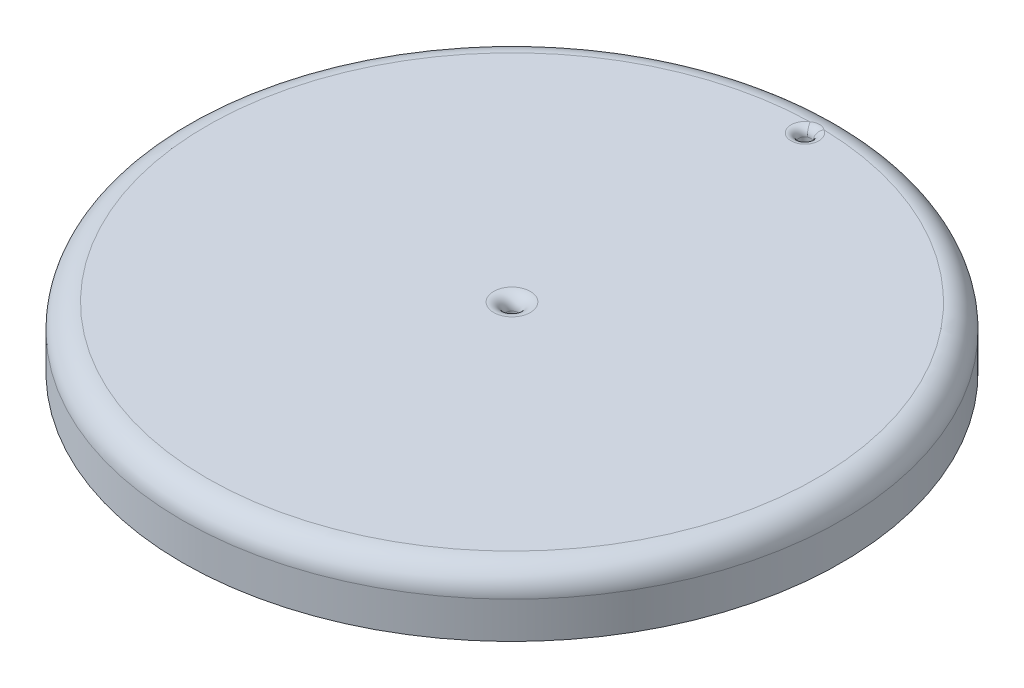
ISO-10303-21;
HEADER;
FILE_DESCRIPTION(('STEP AP214'),'2;1');
FILE_NAME('part.step','',(''),(''),'','','');
FILE_SCHEMA(('AUTOMOTIVE_DESIGN { 1 0 10303 214 1 1 1 1 }'));
ENDSEC;
DATA;
#1=APPLICATION_CONTEXT('core data for automotive mechanical design processes');
#2=APPLICATION_PROTOCOL_DEFINITION('international standard','automotive_design',2000,#1);
#3=PRODUCT_CONTEXT('',#1,'mechanical');
#4=PRODUCT('Part','Part','',(#3));
#5=PRODUCT_RELATED_PRODUCT_CATEGORY('part','',(#4));
#6=PRODUCT_DEFINITION_FORMATION('','',#4);
#7=PRODUCT_DEFINITION_CONTEXT('part definition',#1,'design');
#8=PRODUCT_DEFINITION('design','',#6,#7);
#9=PRODUCT_DEFINITION_SHAPE('','',#8);
#10=(LENGTH_UNIT() NAMED_UNIT(*) SI_UNIT(.MILLI.,.METRE.));
#11=(NAMED_UNIT(*) PLANE_ANGLE_UNIT() SI_UNIT($,.RADIAN.));
#12=(NAMED_UNIT(*) SI_UNIT($,.STERADIAN.) SOLID_ANGLE_UNIT());
#13=UNCERTAINTY_MEASURE_WITH_UNIT(LENGTH_MEASURE(1.E-05),#10,'distance_accuracy_value','');
#14=(GEOMETRIC_REPRESENTATION_CONTEXT(3) GLOBAL_UNCERTAINTY_ASSIGNED_CONTEXT((#13)) GLOBAL_UNIT_ASSIGNED_CONTEXT((#10,
#11,#12)) REPRESENTATION_CONTEXT('',''));
#15=CARTESIAN_POINT('',(0.,0.,0.));
#16=DIRECTION('',(0.,0.,1.));
#17=DIRECTION('',(1.,0.,0.));
#18=AXIS2_PLACEMENT_3D('',#15,#16,#17);
#19=CARTESIAN_POINT('',(0.,15.875,0.));
#20=DIRECTION('',(0.,1.,0.));
#21=DIRECTION('',(0.,0.,1.));
#22=AXIS2_PLACEMENT_3D('',#19,#20,#21);
#23=PLANE('',#22);
#24=CARTESIAN_POINT('',(0.,15.875,0.));
#25=DIRECTION('',(0.,1.,0.));
#26=DIRECTION('',(0.,0.,1.));
#27=AXIS2_PLACEMENT_3D('',#24,#25,#26);
#28=CIRCLE('',#27,4.7625);
#29=CARTESIAN_POINT('',(0.,15.875,4.7625));
#30=VERTEX_POINT('',#29);
#31=EDGE_CURVE('E77',#30,#30,#28,.F.);
#32=ORIENTED_EDGE('',*,*,#31,.T.);
#33=EDGE_LOOP('',(#32));
#34=FACE_BOUND('',#33,.T.);
#35=CARTESIAN_POINT('',(0.,15.875,0.));
#36=DIRECTION('',(0.,1.,0.));
#37=DIRECTION('',(0.,0.,1.));
#38=AXIS2_PLACEMENT_3D('',#35,#36,#37);
#39=CIRCLE('',#38,79.375);
#40=CARTESIAN_POINT('',(-1.77358459821745,15.875,-79.3551827083333));
#41=VERTEX_POINT('',#40);
#42=CARTESIAN_POINT('',(1.77358459821745,15.875,-79.3551827083333));
#43=VERTEX_POINT('',#42);
#44=EDGE_CURVE('E125',#41,#43,#39,.T.);
#45=ORIENTED_EDGE('',*,*,#44,.T.);
#46=CARTESIAN_POINT('',(0.,15.875,-76.2));
#47=DIRECTION('',(0.,1.,0.));
#48=DIRECTION('',(0.,0.,1.));
#49=AXIS2_PLACEMENT_3D('',#46,#47,#48);
#50=CIRCLE('',#49,3.6195);
#51=EDGE_CURVE('E47',#43,#41,#50,.F.);
#52=ORIENTED_EDGE('',*,*,#51,.T.);
#53=EDGE_LOOP('',(#45,#52));
#54=FACE_BOUND('',#53,.T.);
#55=ADVANCED_FACE('F34',(#34,#54),#23,.T.);
#56=CARTESIAN_POINT('',(0.,0.,0.));
#57=DIRECTION('',(0.,1.,0.));
#58=DIRECTION('',(0.,0.,1.));
#59=AXIS2_PLACEMENT_3D('',#56,#57,#58);
#60=PLANE('',#59);
#61=CARTESIAN_POINT('',(0.,0.,0.));
#62=DIRECTION('',(0.,1.,0.));
#63=DIRECTION('',(0.,0.,1.));
#64=AXIS2_PLACEMENT_3D('',#61,#62,#63);
#65=CIRCLE('',#64,1.5875);
#66=CARTESIAN_POINT('',(0.,0.,1.5875));
#67=VERTEX_POINT('',#66);
#68=EDGE_CURVE('E115',#67,#67,#65,.T.);
#69=ORIENTED_EDGE('',*,*,#68,.T.);
#70=EDGE_LOOP('',(#69));
#71=FACE_BOUND('',#70,.T.);
#72=CARTESIAN_POINT('',(0.,0.,0.));
#73=DIRECTION('',(0.,1.,0.));
#74=DIRECTION('',(0.,0.,1.));
#75=AXIS2_PLACEMENT_3D('',#72,#73,#74);
#76=CIRCLE('',#75,85.725);
#77=CARTESIAN_POINT('',(0.,0.,85.725));
#78=VERTEX_POINT('',#77);
#79=EDGE_CURVE('E120',#78,#78,#76,.T.);
#80=ORIENTED_EDGE('',*,*,#79,.F.);
#81=EDGE_LOOP('',(#80));
#82=FACE_BOUND('',#81,.T.);
#83=CARTESIAN_POINT('',(0.,0.,-76.2));
#84=DIRECTION('',(0.,1.,0.));
#85=DIRECTION('',(0.,0.,1.));
#86=AXIS2_PLACEMENT_3D('',#83,#84,#85);
#87=CIRCLE('',#86,1.5875);
#88=CARTESIAN_POINT('',(0.,0.,-74.6125));
#89=VERTEX_POINT('',#88);
#90=EDGE_CURVE('E113',#89,#89,#87,.T.);
#91=ORIENTED_EDGE('',*,*,#90,.T.);
#92=EDGE_LOOP('',(#91));
#93=FACE_BOUND('',#92,.T.);
#94=ADVANCED_FACE('F145',(#71,#82,#93),#60,.F.);
#95=CARTESIAN_POINT('',(0.,15.875,0.));
#96=DIRECTION('',(0.,-1.,0.));
#97=DIRECTION('',(0.,0.,-1.));
#98=AXIS2_PLACEMENT_3D('',#95,#96,#97);
#99=CYLINDRICAL_SURFACE('',#98,85.725);
#100=CARTESIAN_POINT('',(0.,9.525,0.));
#101=DIRECTION('',(0.,1.,0.));
#102=DIRECTION('',(0.,0.,1.));
#103=AXIS2_PLACEMENT_3D('',#100,#101,#102);
#104=CIRCLE('',#103,85.725);
#105=CARTESIAN_POINT('',(0.,9.525,85.725));
#106=VERTEX_POINT('',#105);
#107=EDGE_CURVE('E127',#106,#106,#104,.F.);
#108=ORIENTED_EDGE('',*,*,#107,.T.);
#109=EDGE_LOOP('',(#108));
#110=FACE_BOUND('',#109,.T.);
#111=ORIENTED_EDGE('',*,*,#79,.T.);
#112=EDGE_LOOP('',(#111));
#113=FACE_BOUND('',#112,.T.);
#114=ADVANCED_FACE('F107',(#110,#113),#99,.T.);
#115=CARTESIAN_POINT('',(0.,15.875,0.));
#116=DIRECTION('',(0.,-1.,0.));
#117=DIRECTION('',(0.,0.,-1.));
#118=AXIS2_PLACEMENT_3D('',#115,#116,#117);
#119=CYLINDRICAL_SURFACE('',#118,1.5875);
#120=CARTESIAN_POINT('',(0.,12.7,0.));
#121=DIRECTION('',(0.,1.,0.));
#122=DIRECTION('',(0.,0.,1.));
#123=AXIS2_PLACEMENT_3D('',#120,#121,#122);
#124=CIRCLE('',#123,1.5875);
#125=CARTESIAN_POINT('',(0.,12.7,1.5875));
#126=VERTEX_POINT('',#125);
#127=EDGE_CURVE('E130',#126,#126,#124,.T.);
#128=ORIENTED_EDGE('',*,*,#127,.T.);
#129=EDGE_LOOP('',(#128));
#130=FACE_BOUND('',#129,.T.);
#131=ORIENTED_EDGE('',*,*,#68,.F.);
#132=EDGE_LOOP('',(#131));
#133=FACE_BOUND('',#132,.T.);
#134=ADVANCED_FACE('F140',(#130,#133),#119,.F.);
#135=CARTESIAN_POINT('',(0.,15.875,-76.2));
#136=DIRECTION('',(0.,-1.,0.));
#137=DIRECTION('',(0.,0.,-1.));
#138=AXIS2_PLACEMENT_3D('',#135,#136,#137);
#139=CYLINDRICAL_SURFACE('',#138,1.5875);
#140=CARTESIAN_POINT('',(0.,13.843,-76.2));
#141=DIRECTION('',(0.,1.,0.));
#142=DIRECTION('',(0.,0.,1.));
#143=AXIS2_PLACEMENT_3D('',#140,#141,#142);
#144=CIRCLE('',#143,1.5875);
#145=CARTESIAN_POINT('',(-0.777887981674323,13.843,-77.5838520650585));
#146=VERTEX_POINT('',#145);
#147=CARTESIAN_POINT('',(0.777887981674323,13.843,-77.5838520650585));
#148=VERTEX_POINT('',#147);
#149=EDGE_CURVE('E75',#146,#148,#144,.T.);
#150=ORIENTED_EDGE('',*,*,#149,.T.);
#151=CARTESIAN_POINT('',(2.63476197439983,15.8003909541031,-78.360166683392));
#152=CARTESIAN_POINT('',(1.29553027419903,15.6046192049638,-77.1386593004138));
#153=CARTESIAN_POINT('',(1.16017491639139,13.7922658487901,-77.2835822134828));
#154=CARTESIAN_POINT('',(2.57294908801326,15.8152666369794,-78.4585026395729));
#155=CARTESIAN_POINT('',(1.25561948615888,15.6322657191686,-77.1888661477291));
#156=CARTESIAN_POINT('',(1.13249688038497,13.8023813135206,-77.3132212760861));
#157=CARTESIAN_POINT('',(2.50832767251595,15.8273547353237,-78.553426543925));
#158=CARTESIAN_POINT('',(1.21430838849496,15.6583466104703,-77.2355977513547));
#159=CARTESIAN_POINT('',(1.10363331625003,13.8106012204456,-77.3418428269935));
#160=CARTESIAN_POINT('',(2.37392623025085,15.8468919941276,-78.7357579610215));
#161=CARTESIAN_POINT('',(1.1296876644374,15.7079386864221,-77.3225792838114));
#162=CARTESIAN_POINT('',(1.0437372140149,13.823886556296,-77.3968373152801));
#163=CARTESIAN_POINT('',(2.30414921478429,15.8543438389557,-78.823169797899));
#164=CARTESIAN_POINT('',(1.08633357760566,15.731447265617,-77.3628095145647));
#165=CARTESIAN_POINT('',(1.01270594260589,13.8289538105919,-77.4232115461974));
#166=CARTESIAN_POINT('',(2.08797842250015,15.8711430764972,-79.0728964613576));
#167=CARTESIAN_POINT('',(0.954443826856358,15.7988444487487,-77.4741569728456));
#168=CARTESIAN_POINT('',(0.916754810817013,13.8403772918144,-77.4985817774826));
#169=CARTESIAN_POINT('',(1.93446767676193,15.874991606468,-79.2231430244142));
#170=CARTESIAN_POINT('',(0.864910306286867,15.839058604007,-77.5349037831248));
#171=CARTESIAN_POINT('',(0.848853529601271,13.8429942923296,-77.5439581546539));
#172=CARTESIAN_POINT('',(1.59737548987739,15.8750091931159,-79.4998007451051));
#173=CARTESIAN_POINT('',(0.680776706003383,15.9151082691116,-77.6384751761009));
#174=CARTESIAN_POINT('',(0.700162119910589,13.843006251394,-77.6275463456764));
#175=CARTESIAN_POINT('',(1.41232254099972,15.870411763715,-79.6225778341049));
#176=CARTESIAN_POINT('',(0.58694637861011,15.9498324628814,-77.6783200423195));
#177=CARTESIAN_POINT('',(0.618760367913626,13.8398799993966,-77.6646638665206));
#178=CARTESIAN_POINT('',(1.02991920695333,15.8595849939134,-79.8212372885054));
#179=CARTESIAN_POINT('',(0.408131649744798,16.0082118246832,-77.7377187457377));
#180=CARTESIAN_POINT('',(0.450866708262734,13.8325177957906,-77.7247378993115));
#181=CARTESIAN_POINT('',(0.832564500706439,15.8533550776003,-79.8971030726351));
#182=CARTESIAN_POINT('',(0.323813979747111,16.0315118334129,-77.7567594909913));
#183=CARTESIAN_POINT('',(0.364373012627413,13.8282814525614,-77.7476894041327));
#184=CARTESIAN_POINT('',(0.431488738224897,15.8442989954559,-79.9997887674619));
#185=CARTESIAN_POINT('',(0.162220236122496,16.0638111872643,-77.7815404713182));
#186=CARTESIAN_POINT('',(0.188758283934383,13.8221233171167,-77.7787575839727));
#187=CARTESIAN_POINT('',(0.227768929124186,15.8414721670849,-80.0266182254598));
#188=CARTESIAN_POINT('',(0.0856994334813405,16.0725404113713,-77.78705194089));
#189=CARTESIAN_POINT('',(0.0996377657494023,13.8202010743741,-77.7868771467489));
#190=CARTESIAN_POINT('',(-0.179926143933166,15.8410812389725,-80.0305067681218));
#191=CARTESIAN_POINT('',(-0.0677330635023395,16.0737995868649,-77.7878985772764));
#192=CARTESIAN_POINT('',(-0.0787089253417382,13.8199352432596,-77.7880538735867));
#193=CARTESIAN_POINT('',(-0.383901429848437,15.8435176278016,-80.0075612323042));
#194=CARTESIAN_POINT('',(-0.143910211269564,16.0663160331561,-77.7832249938739));
#195=CARTESIAN_POINT('',(-0.167935107287957,13.8215919871157,-77.7811096393156));
#196=CARTESIAN_POINT('',(-0.793802457650764,15.8522364593302,-79.9106665111826));
#197=CARTESIAN_POINT('',(-0.307524862784396,16.035720078436,-77.7601685436749));
#198=CARTESIAN_POINT('',(-0.347389746513449,13.8275207921256,-77.7517927396579));
#199=CARTESIAN_POINT('',(-0.999493142301692,15.8586654222696,-79.8347599891521));
#200=CARTESIAN_POINT('',(-0.394481485848121,16.0122886807185,-77.7414868752876));
#201=CARTESIAN_POINT('',(-0.437521204546573,13.8318924870695,-77.7288279915613));
#202=CARTESIAN_POINT('',(-1.39783616441427,15.8700525604506,-79.6321430283377));
#203=CARTESIAN_POINT('',(-0.579575166401877,15.9525759725653,-77.6814351418448));
#204=CARTESIAN_POINT('',(-0.612388543817121,13.8396357411802,-77.6675555819736));
#205=CARTESIAN_POINT('',(-1.59049234694427,15.8750111709068,-79.5054476488846));
#206=CARTESIAN_POINT('',(-0.676953129766058,15.9166930292928,-77.6406278591764));
#207=CARTESIAN_POINT('',(-0.697126015794901,13.843007596293,-77.6292524684428));
#208=CARTESIAN_POINT('',(-1.9345010183337,15.874990182095,-79.2231176092681));
#209=CARTESIAN_POINT('',(-0.864920702143404,15.8390495062375,-77.5348962116));
#210=CARTESIAN_POINT('',(-0.848868191598533,13.8429933237574,-77.5439504835681));
#211=CARTESIAN_POINT('',(-2.08802994275089,15.8711415412774,-79.0728466044338));
#212=CARTESIAN_POINT('',(-0.954472116337798,15.7988308120282,-77.4741373155424));
#213=CARTESIAN_POINT('',(-0.916777589592525,13.8403762478732,-77.498566721491));
#214=CARTESIAN_POINT('',(-2.30420464668303,15.8543382952961,-78.8231009095184));
#215=CARTESIAN_POINT('',(-1.08636872240786,15.7314289125106,-77.3627777523877));
#216=CARTESIAN_POINT('',(-1.01273059197551,13.8289500408993,-77.4231907592454));
#217=CARTESIAN_POINT('',(-2.37396843901959,15.8468866751714,-78.7357025669373));
#218=CARTESIAN_POINT('',(-1.12971452245444,15.7079237647589,-77.3225531259758));
#219=CARTESIAN_POINT('',(-1.04375600888249,13.8238829393936,-77.3968206043952));
#220=CARTESIAN_POINT('',(-2.50834716909461,15.8273510837474,-78.5533982233963));
#221=CARTESIAN_POINT('',(-1.2143205027275,15.6583387001421,-77.2355838543463));
#222=CARTESIAN_POINT('',(-1.10364202050565,13.8105987373557,-77.34183428803));
#223=CARTESIAN_POINT('',(-2.57295894427611,15.8152642931996,-78.4584876812297));
#224=CARTESIAN_POINT('',(-1.25562507385757,15.6322613047309,-77.1888586931975));
#225=CARTESIAN_POINT('',(-1.13250128490472,13.8023797197343,-77.3132167680414));
#226=CARTESIAN_POINT('',(-2.63476197439983,15.8003909541031,-78.360166683392));
#227=CARTESIAN_POINT('',(-1.29553027419903,15.6046192049638,-77.1386593004138));
#228=CARTESIAN_POINT('',(-1.16017491639139,13.7922658487901,-77.2835822134828));
#229=(BOUNDED_SURFACE() B_SPLINE_SURFACE(3,2,((#151,#152,#153),(#154,#155,#156),(#157,#158,
#159),(#160,#161,#162),(#163,#164,#165),(#166,#167,#168),(#169,#170,#171),(#172,#173,#174),
(#175,#176,#177),(#178,#179,#180),(#181,#182,#183),(#184,#185,#186),(#187,#188,#189),(#190,#191,
#192),(#193,#194,#195),(#196,#197,#198),(#199,#200,#201),(#202,#203,#204),(#205,#206,#207),
(#208,#209,#210),(#211,#212,#213),(#214,#215,#216),(#217,#218,#219),(#220,#221,#222),(#223,#224,
#225),(#226,#227,#228)),.UNSPECIFIED.,.F.,.F.,.F.) B_SPLINE_SURFACE_WITH_KNOTS((4,2,2,2,2,2,2,2,
2,2,2,2,4),(3,3),(0.,0.278848523464951,0.557535444362937,1.11367568558526,1.72279490995869,
2.33212931074165,2.94134506236532,3.55061736830444,4.18368960617527,4.81657427138734,
5.37280499095196,5.65144249490029,5.93024974394765),(0.,1.),
.UNSPECIFIED.) GEOMETRIC_REPRESENTATION_ITEM() RATIONAL_B_SPLINE_SURFACE(((1.,0.744318728486801,
1.),(1.,0.741621220713077,1.),(1.,0.738734719702184,1.),(1.,0.732715225905634,1.),(1.,
0.72958237694013,1.),(1.,0.720020323008407,1.),(1.,0.713414528674412,1.),(1.,0.700198145607671,
1.),(1.,0.693647046625309,1.),(1.,0.682501589013159,1.),(1.,0.677907922435623,1.),(1.,
0.671584595966648,1.),(1.,0.669854378572044,1.),(1.,0.669606891523882,1.),(1.,0.671089920147483,
1.),(1.,0.677085456484519,1.),(1.,0.681714041414561,1.),(1.,0.693135866746663,1.),(1.,
0.699928465377698,1.),(1.,0.713415671237278,1.),(1.,0.720022501948145,1.),(1.,0.729584879247515,
1.),(1.,0.73271712882438,1.),(1.,0.738735580236999,1.),(1.,0.741621631018794,1.),(1.,
0.744318728486801,1.))) REPRESENTATION_ITEM('') SURFACE());
#230=CARTESIAN_POINT('',(1.16017491639139,13.7922658487901,-77.2835822134828));
#231=CARTESIAN_POINT('',(1.13249688038497,13.8023813135206,-77.3132212760861));
#232=CARTESIAN_POINT('',(1.10363331625003,13.8106012204456,-77.3418428269935));
#233=CARTESIAN_POINT('',(1.0437372140149,13.823886556296,-77.3968373152801));
#234=CARTESIAN_POINT('',(1.01270594260589,13.8289538105919,-77.4232115461974));
#235=CARTESIAN_POINT('',(0.916754810817013,13.8403772918144,-77.4985817774826));
#236=CARTESIAN_POINT('',(0.848853529601271,13.8429942923296,-77.5439581546539));
#237=CARTESIAN_POINT('',(0.700162119910589,13.843006251394,-77.6275463456764));
#238=CARTESIAN_POINT('',(0.618760367913626,13.8398799993966,-77.6646638665206));
#239=CARTESIAN_POINT('',(0.450866708262734,13.8325177957906,-77.7247378993115));
#240=CARTESIAN_POINT('',(0.364373012627413,13.8282814525614,-77.7476894041326));
#241=CARTESIAN_POINT('',(0.188758283934383,13.8221233171167,-77.7787575839727));
#242=CARTESIAN_POINT('',(0.0996377657494023,13.8202010743741,-77.7868771467489));
#243=CARTESIAN_POINT('',(-0.0787089253417382,13.8199352432596,-77.7880538735867));
#244=CARTESIAN_POINT('',(-0.167935107287957,13.8215919871157,-77.7811096393157));
#245=CARTESIAN_POINT('',(-0.347389746513449,13.8275207921256,-77.7517927396579));
#246=CARTESIAN_POINT('',(-0.437521204546573,13.8318924870695,-77.7288279915613));
#247=CARTESIAN_POINT('',(-0.612388543817121,13.8396357411802,-77.6675555819736));
#248=CARTESIAN_POINT('',(-0.697126015794901,13.843007596293,-77.6292524684428));
#249=CARTESIAN_POINT('',(-0.848868191598533,13.8429933237574,-77.5439504835681));
#250=CARTESIAN_POINT('',(-0.916777589592525,13.8403762478732,-77.498566721491));
#251=CARTESIAN_POINT('',(-1.01273059197551,13.8289500408993,-77.4231907592454));
#252=CARTESIAN_POINT('',(-1.04375600888249,13.8238829393936,-77.3968206043952));
#253=CARTESIAN_POINT('',(-1.10364202050565,13.8105987373557,-77.34183428803));
#254=CARTESIAN_POINT('',(-1.13250128490472,13.8023797197343,-77.3132167680414));
#255=CARTESIAN_POINT('',(-1.16017491639139,13.7922658487901,-77.2835822134828));
#256=B_SPLINE_CURVE_WITH_KNOTS('',3,(#230,#231,#232,#233,#234,#235,#236,#237,#238,#239,#240,
#241,#242,#243,#244,#245,#246,#247,#248,#249,#250,#251,#252,#253,#254,#255),.UNSPECIFIED.,.F.,
.F.,(4,2,2,2,2,2,2,2,2,2,2,2,4),(0.,0.278848523464951,0.557535444362937,1.11367568558526,
1.72279490995869,2.33212931074165,2.94134506236532,3.55061736830444,4.18368960617527,
4.81657427138734,5.37280499095196,5.65144249490029,5.93024974394765),.UNSPECIFIED.);
#257=EDGE_CURVE('E72',#148,#146,#256,.T.);
#258=ORIENTED_EDGE('',*,*,#257,.T.);
#259=EDGE_LOOP('',(#150,#258));
#260=FACE_BOUND('',#259,.T.);
#261=ORIENTED_EDGE('',*,*,#90,.F.);
#262=EDGE_LOOP('',(#261));
#263=FACE_BOUND('',#262,.T.);
#264=ADVANCED_FACE('F79',(#260,#263),#139,.F.);
#265=CARTESIAN_POINT('',(0.,9.525,0.));
#266=DIRECTION('',(0.,1.,0.));
#267=DIRECTION('',(0.,0.,1.));
#268=AXIS2_PLACEMENT_3D('',#265,#266,#267);
#269=TOROIDAL_SURFACE('',#268,79.375,6.35);
#270=ORIENTED_EDGE('',*,*,#107,.F.);
#271=EDGE_LOOP('',(#270));
#272=FACE_BOUND('',#271,.T.);
#273=ORIENTED_EDGE('',*,*,#44,.F.);
#274=CARTESIAN_POINT('',(-2.63476197439983,15.8003909541031,-78.360166683392));
#275=CARTESIAN_POINT('',(-2.57295894427611,15.8152642931996,-78.4584876812297));
#276=CARTESIAN_POINT('',(-2.50834716909461,15.8273510837474,-78.5533982233964));
#277=CARTESIAN_POINT('',(-2.37396843901959,15.8468866751714,-78.7357025669373));
#278=CARTESIAN_POINT('',(-2.30420464668303,15.8543382952961,-78.8231009095184));
#279=CARTESIAN_POINT('',(-2.08802994275089,15.8711415412774,-79.0728466044338));
#280=CARTESIAN_POINT('',(-1.9345010183337,15.874990182095,-79.223117609268));
#281=CARTESIAN_POINT('',(-1.59049234694427,15.8750111709068,-79.5054476488846));
#282=CARTESIAN_POINT('',(-1.39783616441427,15.8700525604506,-79.6321430283377));
#283=CARTESIAN_POINT('',(-0.999493142301692,15.8586654222696,-79.8347599891521));
#284=CARTESIAN_POINT('',(-0.793802457650764,15.8522364593302,-79.9106665111825));
#285=CARTESIAN_POINT('',(-0.383901429848437,15.8435176278016,-80.0075612323042));
#286=CARTESIAN_POINT('',(-0.179926143933166,15.8410812389725,-80.0305067681218));
#287=CARTESIAN_POINT('',(0.227768929124186,15.8414721670849,-80.0266182254598));
#288=CARTESIAN_POINT('',(0.431488738224896,15.8442989954559,-79.9997887674619));
#289=CARTESIAN_POINT('',(0.832564500706439,15.8533550776003,-79.8971030726351));
#290=CARTESIAN_POINT('',(1.02991920695333,15.8595849939134,-79.8212372885054));
#291=CARTESIAN_POINT('',(1.41232254099972,15.870411763715,-79.6225778341049));
#292=CARTESIAN_POINT('',(1.59737548987739,15.8750091931159,-79.4998007451051));
#293=CARTESIAN_POINT('',(1.93446767676193,15.874991606468,-79.2231430244142));
#294=CARTESIAN_POINT('',(2.08797842250015,15.8711430764972,-79.0728964613576));
#295=CARTESIAN_POINT('',(2.30414921478429,15.8543438389557,-78.8231697978991));
#296=CARTESIAN_POINT('',(2.37392623025085,15.8468919941276,-78.7357579610215));
#297=CARTESIAN_POINT('',(2.50832767251595,15.8273547353237,-78.553426543925));
#298=CARTESIAN_POINT('',(2.57294908801326,15.8152666369794,-78.4585026395729));
#299=CARTESIAN_POINT('',(2.63476197439983,15.8003909541031,-78.360166683392));
#300=B_SPLINE_CURVE_WITH_KNOTS('',3,(#274,#275,#276,#277,#278,#279,#280,#281,#282,#283,#284,
#285,#286,#287,#288,#289,#290,#291,#292,#293,#294,#295,#296,#297,#298,#299),.UNSPECIFIED.,.F.,
.F.,(4,2,2,2,2,2,2,2,2,2,2,2,4),(0.,0.27880724904736,0.557444752995687,1.11367547256031,
1.74656013777238,2.37963237564321,2.98890468158233,3.598120433206,4.20745483398896,
4.81657405836239,5.37271429958471,5.6514012204827,5.93024974394765),.UNSPECIFIED.);
#301=EDGE_CURVE('E11',#41,#43,#300,.T.);
#302=ORIENTED_EDGE('',*,*,#301,.T.);
#303=EDGE_LOOP('',(#273,#302));
#304=FACE_BOUND('',#303,.T.);
#305=ADVANCED_FACE('F102',(#272,#304),#269,.T.);
#306=CARTESIAN_POINT('',(0.,12.7,0.));
#307=DIRECTION('',(0.,1.,0.));
#308=DIRECTION('',(0.,0.,1.));
#309=AXIS2_PLACEMENT_3D('',#306,#307,#308);
#310=TOROIDAL_SURFACE('',#309,4.7625,3.175);
#311=ORIENTED_EDGE('',*,*,#31,.F.);
#312=EDGE_LOOP('',(#311));
#313=FACE_BOUND('',#312,.T.);
#314=ORIENTED_EDGE('',*,*,#127,.F.);
#315=EDGE_LOOP('',(#314));
#316=FACE_BOUND('',#315,.T.);
#317=ADVANCED_FACE('F95',(#313,#316),#310,.T.);
#318=CARTESIAN_POINT('',(0.,13.843,-76.2));
#319=DIRECTION('',(0.,1.,0.));
#320=DIRECTION('',(0.,0.,1.));
#321=AXIS2_PLACEMENT_3D('',#318,#319,#320);
#322=TOROIDAL_SURFACE('',#321,3.6195,2.032);
#323=CARTESIAN_POINT('',(-1.77358459821745,13.843,-79.3551827083333));
#324=DIRECTION('',(0.871717836257315,0.,-0.490008177432647));
#325=DIRECTION('',(-0.490008177432647,0.,-0.871717836257315));
#326=AXIS2_PLACEMENT_3D('',#323,#324,#325);
#327=CIRCLE('',#326,2.032);
#328=EDGE_CURVE('E68',#41,#146,#327,.T.);
#329=ORIENTED_EDGE('',*,*,#328,.F.);
#330=ORIENTED_EDGE('',*,*,#51,.F.);
#331=CARTESIAN_POINT('',(1.77358459821746,13.843,-79.3551827083334));
#332=DIRECTION('',(-0.871717836257317,0.,-0.490008177432645));
#333=DIRECTION('',(-0.490008177432645,0.,0.871717836257317));
#334=AXIS2_PLACEMENT_3D('',#331,#332,#333);
#335=CIRCLE('',#334,2.032);
#336=EDGE_CURVE('E61',#148,#43,#335,.T.);
#337=ORIENTED_EDGE('',*,*,#336,.F.);
#338=ORIENTED_EDGE('',*,*,#149,.F.);
#339=EDGE_LOOP('',(#329,#330,#337,#338));
#340=FACE_BOUND('',#339,.T.);
#341=ADVANCED_FACE('F36',(#340),#322,.T.);
#342=ORIENTED_EDGE('',*,*,#336,.T.);
#343=ORIENTED_EDGE('',*,*,#301,.F.);
#344=ORIENTED_EDGE('',*,*,#328,.T.);
#345=ORIENTED_EDGE('',*,*,#257,.F.);
#346=EDGE_LOOP('',(#342,#343,#344,#345));
#347=FACE_BOUND('',#346,.T.);
#348=ADVANCED_FACE('F70',(#347),#229,.T.);
#349=CLOSED_SHELL('',(#55,#94,#114,#134,#264,#305,#317,#341,#348));
#350=MANIFOLD_SOLID_BREP('B2',#349);
#351=ADVANCED_BREP_SHAPE_REPRESENTATION('',(#18,#350),#14);
#352=SHAPE_DEFINITION_REPRESENTATION(#9,#351);
ENDSEC;
END-ISO-10303-21;
